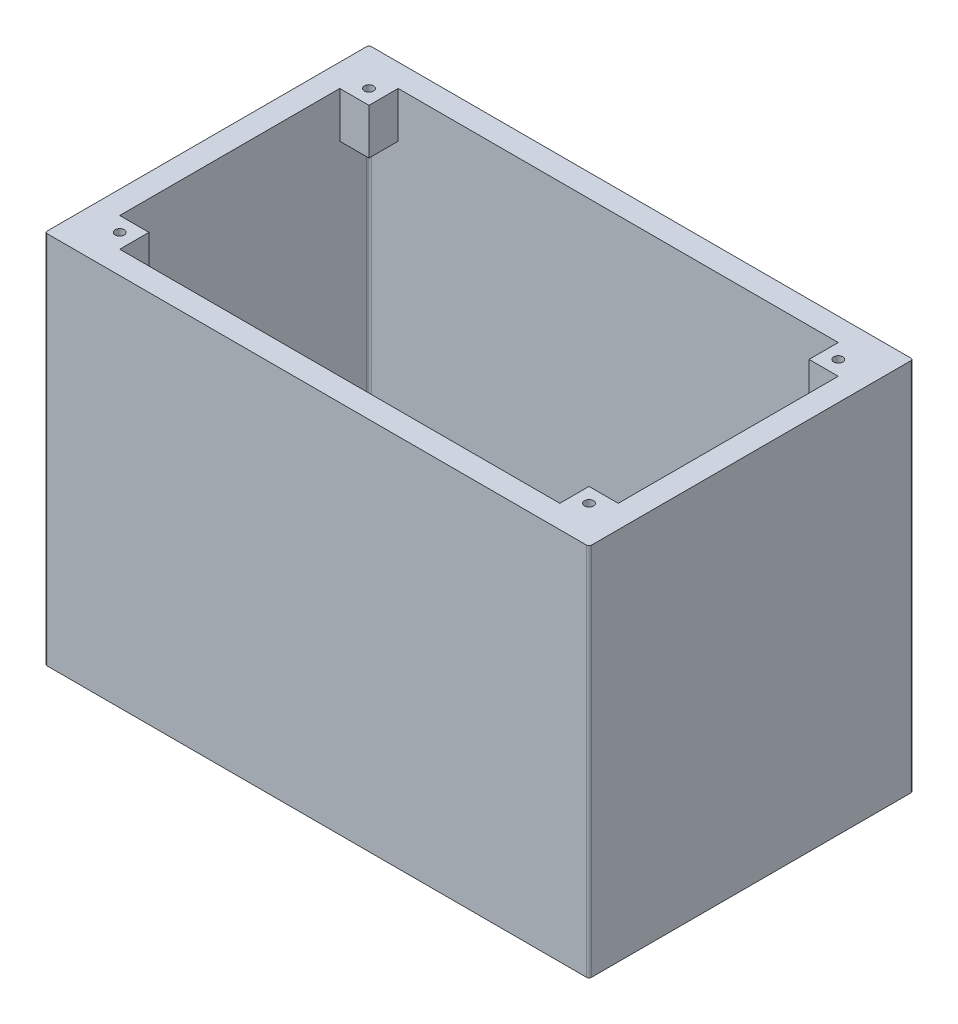
ISO-10303-21;
HEADER;
FILE_DESCRIPTION(('STEP AP214'),'2;1');
FILE_NAME('part.step','',(''),(''),'','','');
FILE_SCHEMA(('AUTOMOTIVE_DESIGN { 1 0 10303 214 1 1 1 1 }'));
ENDSEC;
DATA;
#1=APPLICATION_CONTEXT('core data for automotive mechanical design processes');
#2=APPLICATION_PROTOCOL_DEFINITION('international standard','automotive_design',2000,#1);
#3=PRODUCT_CONTEXT('',#1,'mechanical');
#4=PRODUCT('Part','Part','',(#3));
#5=PRODUCT_RELATED_PRODUCT_CATEGORY('part','',(#4));
#6=PRODUCT_DEFINITION_FORMATION('','',#4);
#7=PRODUCT_DEFINITION_CONTEXT('part definition',#1,'design');
#8=PRODUCT_DEFINITION('design','',#6,#7);
#9=PRODUCT_DEFINITION_SHAPE('','',#8);
#10=(LENGTH_UNIT() NAMED_UNIT(*) SI_UNIT(.MILLI.,.METRE.));
#11=(NAMED_UNIT(*) PLANE_ANGLE_UNIT() SI_UNIT($,.RADIAN.));
#12=(NAMED_UNIT(*) SI_UNIT($,.STERADIAN.) SOLID_ANGLE_UNIT());
#13=UNCERTAINTY_MEASURE_WITH_UNIT(LENGTH_MEASURE(1.E-05),#10,'distance_accuracy_value','');
#14=(GEOMETRIC_REPRESENTATION_CONTEXT(3) GLOBAL_UNCERTAINTY_ASSIGNED_CONTEXT((#13)) GLOBAL_UNIT_ASSIGNED_CONTEXT((#10,
#11,#12)) REPRESENTATION_CONTEXT('',''));
#15=CARTESIAN_POINT('',(0.,0.,0.));
#16=DIRECTION('',(0.,0.,1.));
#17=DIRECTION('',(1.,0.,0.));
#18=AXIS2_PLACEMENT_3D('',#15,#16,#17);
#19=CARTESIAN_POINT('',(-27.3,41.,-15.25));
#20=DIRECTION('',(1.,0.,0.));
#21=DIRECTION('',(0.,0.,-1.));
#22=AXIS2_PLACEMENT_3D('',#19,#20,#21);
#23=PLANE('',#22);
#24=CARTESIAN_POINT('',(-27.3,12.,5.49999999999999));
#25=DIRECTION('',(1.,0.,0.));
#26=DIRECTION('',(0.,0.,-1.));
#27=AXIS2_PLACEMENT_3D('',#24,#25,#26);
#28=CIRCLE('',#27,2.);
#29=CARTESIAN_POINT('',(-27.3,12.,3.49999999999999));
#30=VERTEX_POINT('',#29);
#31=EDGE_CURVE('E467',#30,#30,#28,.T.);
#32=ORIENTED_EDGE('',*,*,#31,.F.);
#33=EDGE_LOOP('',(#32));
#34=FACE_BOUND('',#33,.T.);
#35=DIRECTION('',(0.,0.,-1.));
#36=VECTOR('',#35,1.);
#37=CARTESIAN_POINT('',(-27.3,36.,0.));
#38=LINE('',#37,#36);
#39=CARTESIAN_POINT('',(-27.3,36.,15.));
#40=VERTEX_POINT('',#39);
#41=CARTESIAN_POINT('',(-27.3,36.,12.0499999999999));
#42=VERTEX_POINT('',#41);
#43=EDGE_CURVE('E232',#40,#42,#38,.T.);
#44=ORIENTED_EDGE('',*,*,#43,.F.);
#45=DIRECTION('',(0.,-1.,0.));
#46=VECTOR('',#45,1.);
#47=CARTESIAN_POINT('',(-27.3,2.5,15.));
#48=LINE('',#47,#46);
#49=CARTESIAN_POINT('',(-27.3,2.5,15.));
#50=VERTEX_POINT('',#49);
#51=EDGE_CURVE('E452',#40,#50,#48,.T.);
#52=ORIENTED_EDGE('',*,*,#51,.T.);
#53=DIRECTION('',(0.,0.,1.));
#54=VECTOR('',#53,1.);
#55=CARTESIAN_POINT('',(-27.3,2.5,-15.25));
#56=LINE('',#55,#54);
#57=CARTESIAN_POINT('',(-27.3,2.5,-15.));
#58=VERTEX_POINT('',#57);
#59=EDGE_CURVE('E350',#58,#50,#56,.T.);
#60=ORIENTED_EDGE('',*,*,#59,.F.);
#61=DIRECTION('',(0.,-1.,0.));
#62=VECTOR('',#61,1.);
#63=CARTESIAN_POINT('',(-27.3,36.,-15.));
#64=LINE('',#63,#62);
#65=CARTESIAN_POINT('',(-27.3,36.,-15.));
#66=VERTEX_POINT('',#65);
#67=EDGE_CURVE('E450',#58,#66,#64,.F.);
#68=ORIENTED_EDGE('',*,*,#67,.T.);
#69=DIRECTION('',(0.,0.,-1.));
#70=VECTOR('',#69,1.);
#71=CARTESIAN_POINT('',(-27.3,36.,0.));
#72=LINE('',#71,#70);
#73=CARTESIAN_POINT('',(-27.3,36.,-12.05));
#74=VERTEX_POINT('',#73);
#75=EDGE_CURVE('E334',#74,#66,#72,.T.);
#76=ORIENTED_EDGE('',*,*,#75,.F.);
#77=DIRECTION('',(0.,1.,0.));
#78=VECTOR('',#77,1.);
#79=CARTESIAN_POINT('',(-27.3,36.,-12.05));
#80=LINE('',#79,#78);
#81=CARTESIAN_POINT('',(-27.3,41.,-12.05));
#82=VERTEX_POINT('',#81);
#83=EDGE_CURVE('E351',#74,#82,#80,.T.);
#84=ORIENTED_EDGE('',*,*,#83,.T.);
#85=DIRECTION('',(0.,0.,1.));
#86=VECTOR('',#85,1.);
#87=CARTESIAN_POINT('',(-27.3,41.,-15.25));
#88=LINE('',#87,#86);
#89=CARTESIAN_POINT('',(-27.3,41.,12.0499999999999));
#90=VERTEX_POINT('',#89);
#91=EDGE_CURVE('E358',#82,#90,#88,.T.);
#92=ORIENTED_EDGE('',*,*,#91,.T.);
#93=DIRECTION('',(0.,1.,0.));
#94=VECTOR('',#93,1.);
#95=CARTESIAN_POINT('',(-27.3,36.,12.0499999999999));
#96=LINE('',#95,#94);
#97=EDGE_CURVE('E255',#42,#90,#96,.T.);
#98=ORIENTED_EDGE('',*,*,#97,.F.);
#99=EDGE_LOOP('',(#44,#52,#60,#68,#76,#84,#92,#98));
#100=FACE_BOUND('',#99,.T.);
#101=ADVANCED_FACE('F39',(#34,#100),#23,.T.);
#102=CARTESIAN_POINT('',(-27.3,41.,15.25));
#103=DIRECTION('',(0.,0.,-1.));
#104=DIRECTION('',(-1.,0.,0.));
#105=AXIS2_PLACEMENT_3D('',#102,#103,#104);
#106=PLANE('',#105);
#107=DIRECTION('',(-1.,0.,0.));
#108=VECTOR('',#107,1.);
#109=CARTESIAN_POINT('',(0.,36.,15.25));
#110=LINE('',#109,#108);
#111=CARTESIAN_POINT('',(27.05,36.,15.25));
#112=VERTEX_POINT('',#111);
#113=CARTESIAN_POINT('',(24.1,36.,15.25));
#114=VERTEX_POINT('',#113);
#115=EDGE_CURVE('E280',#112,#114,#110,.T.);
#116=ORIENTED_EDGE('',*,*,#115,.F.);
#117=DIRECTION('',(0.,-1.,0.));
#118=VECTOR('',#117,1.);
#119=CARTESIAN_POINT('',(27.05,2.5,15.25));
#120=LINE('',#119,#118);
#121=CARTESIAN_POINT('',(27.05,2.5,15.25));
#122=VERTEX_POINT('',#121);
#123=EDGE_CURVE('E434',#112,#122,#120,.T.);
#124=ORIENTED_EDGE('',*,*,#123,.T.);
#125=DIRECTION('',(1.,0.,0.));
#126=VECTOR('',#125,1.);
#127=CARTESIAN_POINT('',(-27.3,2.5,15.25));
#128=LINE('',#127,#126);
#129=CARTESIAN_POINT('',(-27.05,2.5,15.25));
#130=VERTEX_POINT('',#129);
#131=EDGE_CURVE('E368',#130,#122,#128,.T.);
#132=ORIENTED_EDGE('',*,*,#131,.F.);
#133=DIRECTION('',(0.,-1.,0.));
#134=VECTOR('',#133,1.);
#135=CARTESIAN_POINT('',(-27.05,36.,15.25));
#136=LINE('',#135,#134);
#137=CARTESIAN_POINT('',(-27.05,36.,15.25));
#138=VERTEX_POINT('',#137);
#139=EDGE_CURVE('E432',#130,#138,#136,.F.);
#140=ORIENTED_EDGE('',*,*,#139,.T.);
#141=DIRECTION('',(-1.,0.,0.));
#142=VECTOR('',#141,1.);
#143=CARTESIAN_POINT('',(0.,36.,15.25));
#144=LINE('',#143,#142);
#145=CARTESIAN_POINT('',(-24.1,36.,15.25));
#146=VERTEX_POINT('',#145);
#147=EDGE_CURVE('E252',#146,#138,#144,.T.);
#148=ORIENTED_EDGE('',*,*,#147,.F.);
#149=DIRECTION('',(0.,1.,0.));
#150=VECTOR('',#149,1.);
#151=CARTESIAN_POINT('',(-24.1,36.,15.25));
#152=LINE('',#151,#150);
#153=CARTESIAN_POINT('',(-24.1,41.,15.25));
#154=VERTEX_POINT('',#153);
#155=EDGE_CURVE('E247',#146,#154,#152,.T.);
#156=ORIENTED_EDGE('',*,*,#155,.T.);
#157=DIRECTION('',(1.,0.,0.));
#158=VECTOR('',#157,1.);
#159=CARTESIAN_POINT('',(-27.3,41.,15.25));
#160=LINE('',#159,#158);
#161=CARTESIAN_POINT('',(24.1,41.,15.25));
#162=VERTEX_POINT('',#161);
#163=EDGE_CURVE('E361',#154,#162,#160,.T.);
#164=ORIENTED_EDGE('',*,*,#163,.T.);
#165=DIRECTION('',(0.,1.,0.));
#166=VECTOR('',#165,1.);
#167=CARTESIAN_POINT('',(24.1,36.,15.25));
#168=LINE('',#167,#166);
#169=EDGE_CURVE('E290',#114,#162,#168,.T.);
#170=ORIENTED_EDGE('',*,*,#169,.F.);
#171=EDGE_LOOP('',(#116,#124,#132,#140,#148,#156,#164,#170));
#172=FACE_BOUND('',#171,.T.);
#173=ADVANCED_FACE('F484',(#172),#106,.T.);
#174=CARTESIAN_POINT('',(27.3,41.,-15.25));
#175=DIRECTION('',(-1.,0.,0.));
#176=DIRECTION('',(0.,0.,1.));
#177=AXIS2_PLACEMENT_3D('',#174,#175,#176);
#178=PLANE('',#177);
#179=DIRECTION('',(0.,0.,-1.));
#180=VECTOR('',#179,1.);
#181=CARTESIAN_POINT('',(27.3,2.5,-15.25));
#182=LINE('',#181,#180);
#183=CARTESIAN_POINT('',(27.3,2.5,15.));
#184=VERTEX_POINT('',#183);
#185=CARTESIAN_POINT('',(27.3,2.5,-15.));
#186=VERTEX_POINT('',#185);
#187=EDGE_CURVE('E359',#184,#186,#182,.T.);
#188=ORIENTED_EDGE('',*,*,#187,.F.);
#189=DIRECTION('',(0.,-1.,0.));
#190=VECTOR('',#189,1.);
#191=CARTESIAN_POINT('',(27.3,36.,15.));
#192=LINE('',#191,#190);
#193=CARTESIAN_POINT('',(27.3,36.,15.));
#194=VERTEX_POINT('',#193);
#195=EDGE_CURVE('E446',#184,#194,#192,.F.);
#196=ORIENTED_EDGE('',*,*,#195,.T.);
#197=DIRECTION('',(0.,0.,1.));
#198=VECTOR('',#197,1.);
#199=CARTESIAN_POINT('',(27.3,36.,0.));
#200=LINE('',#199,#198);
#201=CARTESIAN_POINT('',(27.3,36.,12.05));
#202=VERTEX_POINT('',#201);
#203=EDGE_CURVE('E271',#202,#194,#200,.T.);
#204=ORIENTED_EDGE('',*,*,#203,.F.);
#205=DIRECTION('',(0.,1.,0.));
#206=VECTOR('',#205,1.);
#207=CARTESIAN_POINT('',(27.3,36.,12.05));
#208=LINE('',#207,#206);
#209=CARTESIAN_POINT('',(27.3,41.,12.05));
#210=VERTEX_POINT('',#209);
#211=EDGE_CURVE('E282',#202,#210,#208,.T.);
#212=ORIENTED_EDGE('',*,*,#211,.T.);
#213=DIRECTION('',(0.,0.,-1.));
#214=VECTOR('',#213,1.);
#215=CARTESIAN_POINT('',(27.3,41.,-15.25));
#216=LINE('',#215,#214);
#217=CARTESIAN_POINT('',(27.3,41.,-12.05));
#218=VERTEX_POINT('',#217);
#219=EDGE_CURVE('E363',#210,#218,#216,.T.);
#220=ORIENTED_EDGE('',*,*,#219,.T.);
#221=DIRECTION('',(0.,1.,0.));
#222=VECTOR('',#221,1.);
#223=CARTESIAN_POINT('',(27.3,36.,-12.05));
#224=LINE('',#223,#222);
#225=CARTESIAN_POINT('',(27.3,36.,-12.05));
#226=VERTEX_POINT('',#225);
#227=EDGE_CURVE('E319',#226,#218,#224,.T.);
#228=ORIENTED_EDGE('',*,*,#227,.F.);
#229=DIRECTION('',(0.,0.,1.));
#230=VECTOR('',#229,1.);
#231=CARTESIAN_POINT('',(27.3,36.,0.));
#232=LINE('',#231,#230);
#233=CARTESIAN_POINT('',(27.3,36.,-15.));
#234=VERTEX_POINT('',#233);
#235=EDGE_CURVE('E306',#234,#226,#232,.T.);
#236=ORIENTED_EDGE('',*,*,#235,.F.);
#237=DIRECTION('',(0.,-1.,0.));
#238=VECTOR('',#237,1.);
#239=CARTESIAN_POINT('',(27.3,2.5,-15.));
#240=LINE('',#239,#238);
#241=EDGE_CURVE('E443',#234,#186,#240,.T.);
#242=ORIENTED_EDGE('',*,*,#241,.T.);
#243=EDGE_LOOP('',(#188,#196,#204,#212,#220,#228,#236,#242));
#244=FACE_BOUND('',#243,.T.);
#245=ADVANCED_FACE('F492',(#244),#178,.T.);
#246=CARTESIAN_POINT('',(-27.3,41.,-15.25));
#247=DIRECTION('',(0.,0.,1.));
#248=DIRECTION('',(1.,0.,0.));
#249=AXIS2_PLACEMENT_3D('',#246,#247,#248);
#250=PLANE('',#249);
#251=DIRECTION('',(-1.,0.,0.));
#252=VECTOR('',#251,1.);
#253=CARTESIAN_POINT('',(27.3,2.75,-15.25));
#254=LINE('',#253,#252);
#255=CARTESIAN_POINT('',(-27.05,2.75,-15.25));
#256=VERTEX_POINT('',#255);
#257=CARTESIAN_POINT('',(27.05,2.75,-15.25));
#258=VERTEX_POINT('',#257);
#259=EDGE_CURVE('E54',#256,#258,#254,.F.);
#260=ORIENTED_EDGE('',*,*,#259,.T.);
#261=DIRECTION('',(0.,-1.,0.));
#262=VECTOR('',#261,1.);
#263=CARTESIAN_POINT('',(27.05,36.,-15.25));
#264=LINE('',#263,#262);
#265=CARTESIAN_POINT('',(27.05,36.,-15.25));
#266=VERTEX_POINT('',#265);
#267=EDGE_CURVE('E459',#258,#266,#264,.F.);
#268=ORIENTED_EDGE('',*,*,#267,.T.);
#269=DIRECTION('',(1.,0.,0.));
#270=VECTOR('',#269,1.);
#271=CARTESIAN_POINT('',(0.,36.,-15.25));
#272=LINE('',#271,#270);
#273=CARTESIAN_POINT('',(24.1,36.,-15.25));
#274=VERTEX_POINT('',#273);
#275=EDGE_CURVE('E297',#274,#266,#272,.T.);
#276=ORIENTED_EDGE('',*,*,#275,.F.);
#277=DIRECTION('',(0.,1.,0.));
#278=VECTOR('',#277,1.);
#279=CARTESIAN_POINT('',(24.1,36.,-15.25));
#280=LINE('',#279,#278);
#281=CARTESIAN_POINT('',(24.1,41.,-15.25));
#282=VERTEX_POINT('',#281);
#283=EDGE_CURVE('E311',#274,#282,#280,.T.);
#284=ORIENTED_EDGE('',*,*,#283,.T.);
#285=DIRECTION('',(-1.,0.,0.));
#286=VECTOR('',#285,1.);
#287=CARTESIAN_POINT('',(-27.3,41.,-15.25));
#288=LINE('',#287,#286);
#289=CARTESIAN_POINT('',(-24.1,41.,-15.25));
#290=VERTEX_POINT('',#289);
#291=EDGE_CURVE('E356',#282,#290,#288,.T.);
#292=ORIENTED_EDGE('',*,*,#291,.T.);
#293=DIRECTION('',(0.,1.,0.));
#294=VECTOR('',#293,1.);
#295=CARTESIAN_POINT('',(-24.1,36.,-15.25));
#296=LINE('',#295,#294);
#297=CARTESIAN_POINT('',(-24.1,36.,-15.25));
#298=VERTEX_POINT('',#297);
#299=EDGE_CURVE('E340',#298,#290,#296,.T.);
#300=ORIENTED_EDGE('',*,*,#299,.F.);
#301=DIRECTION('',(1.,0.,0.));
#302=VECTOR('',#301,1.);
#303=CARTESIAN_POINT('',(0.,36.,-15.25));
#304=LINE('',#303,#302);
#305=CARTESIAN_POINT('',(-27.05,36.,-15.25));
#306=VERTEX_POINT('',#305);
#307=EDGE_CURVE('E332',#306,#298,#304,.T.);
#308=ORIENTED_EDGE('',*,*,#307,.F.);
#309=DIRECTION('',(0.,-1.,0.));
#310=VECTOR('',#309,1.);
#311=CARTESIAN_POINT('',(-27.05,2.5,-15.25));
#312=LINE('',#311,#310);
#313=EDGE_CURVE('E59',#306,#256,#312,.T.);
#314=ORIENTED_EDGE('',*,*,#313,.T.);
#315=EDGE_LOOP('',(#260,#268,#276,#284,#292,#300,#308,#314));
#316=FACE_BOUND('',#315,.T.);
#317=ADVANCED_FACE('F499',(#316),#250,.T.);
#318=CARTESIAN_POINT('',(-29.8,2.5,-17.75));
#319=DIRECTION('',(0.,0.,-1.));
#320=DIRECTION('',(-1.,0.,0.));
#321=AXIS2_PLACEMENT_3D('',#318,#319,#320);
#322=PLANE('',#321);
#323=DIRECTION('',(-1.,0.,0.));
#324=VECTOR('',#323,1.);
#325=CARTESIAN_POINT('',(-29.8,41.,-17.75));
#326=LINE('',#325,#324);
#327=CARTESIAN_POINT('',(29.55,41.,-17.75));
#328=VERTEX_POINT('',#327);
#329=CARTESIAN_POINT('',(-29.55,41.,-17.75));
#330=VERTEX_POINT('',#329);
#331=EDGE_CURVE('E381',#328,#330,#326,.T.);
#332=ORIENTED_EDGE('',*,*,#331,.F.);
#333=DIRECTION('',(0.,-1.,0.));
#334=VECTOR('',#333,1.);
#335=CARTESIAN_POINT('',(29.55,0.,-17.75));
#336=LINE('',#335,#334);
#337=CARTESIAN_POINT('',(29.55,0.,-17.75));
#338=VERTEX_POINT('',#337);
#339=EDGE_CURVE('E398',#328,#338,#336,.T.);
#340=ORIENTED_EDGE('',*,*,#339,.T.);
#341=DIRECTION('',(1.,0.,0.));
#342=VECTOR('',#341,1.);
#343=CARTESIAN_POINT('',(-29.8,0.,-17.75));
#344=LINE('',#343,#342);
#345=CARTESIAN_POINT('',(-29.55,0.,-17.75));
#346=VERTEX_POINT('',#345);
#347=EDGE_CURVE('E384',#346,#338,#344,.T.);
#348=ORIENTED_EDGE('',*,*,#347,.F.);
#349=DIRECTION('',(0.,-1.,0.));
#350=VECTOR('',#349,1.);
#351=CARTESIAN_POINT('',(-29.55,2.5,-17.75));
#352=LINE('',#351,#350);
#353=EDGE_CURVE('E396',#346,#330,#352,.F.);
#354=ORIENTED_EDGE('',*,*,#353,.T.);
#355=EDGE_LOOP('',(#332,#340,#348,#354));
#356=FACE_BOUND('',#355,.T.);
#357=ADVANCED_FACE('F502',(#356),#322,.T.);
#358=CARTESIAN_POINT('',(-29.8,2.5,17.75));
#359=DIRECTION('',(-1.,0.,0.));
#360=DIRECTION('',(0.,0.,1.));
#361=AXIS2_PLACEMENT_3D('',#358,#359,#360);
#362=PLANE('',#361);
#363=CARTESIAN_POINT('',(-29.8,12.,5.49999999999999));
#364=DIRECTION('',(-1.,0.,0.));
#365=DIRECTION('',(0.,0.,1.));
#366=AXIS2_PLACEMENT_3D('',#363,#364,#365);
#367=CIRCLE('',#366,2.3);
#368=CARTESIAN_POINT('',(-29.8,12.,7.79999999999999));
#369=VERTEX_POINT('',#368);
#370=EDGE_CURVE('E11',#369,#369,#367,.F.);
#371=ORIENTED_EDGE('',*,*,#370,.T.);
#372=EDGE_LOOP('',(#371));
#373=FACE_BOUND('',#372,.T.);
#374=DIRECTION('',(0.,0.,1.));
#375=VECTOR('',#374,1.);
#376=CARTESIAN_POINT('',(-29.8,41.,-17.75));
#377=LINE('',#376,#375);
#378=CARTESIAN_POINT('',(-29.8,41.,-17.5));
#379=VERTEX_POINT('',#378);
#380=CARTESIAN_POINT('',(-29.8,41.,17.5));
#381=VERTEX_POINT('',#380);
#382=EDGE_CURVE('E365',#379,#381,#377,.T.);
#383=ORIENTED_EDGE('',*,*,#382,.F.);
#384=DIRECTION('',(0.,-1.,0.));
#385=VECTOR('',#384,1.);
#386=CARTESIAN_POINT('',(-29.8,2.5,-17.5));
#387=LINE('',#386,#385);
#388=CARTESIAN_POINT('',(-29.8,0.,-17.5));
#389=VERTEX_POINT('',#388);
#390=EDGE_CURVE('E429',#379,#389,#387,.T.);
#391=ORIENTED_EDGE('',*,*,#390,.T.);
#392=DIRECTION('',(0.,0.,-1.));
#393=VECTOR('',#392,1.);
#394=CARTESIAN_POINT('',(-29.8,0.,17.75));
#395=LINE('',#394,#393);
#396=CARTESIAN_POINT('',(-29.8,0.,17.5));
#397=VERTEX_POINT('',#396);
#398=EDGE_CURVE('E393',#397,#389,#395,.T.);
#399=ORIENTED_EDGE('',*,*,#398,.F.);
#400=DIRECTION('',(0.,-1.,0.));
#401=VECTOR('',#400,1.);
#402=CARTESIAN_POINT('',(-29.8,41.,17.5));
#403=LINE('',#402,#401);
#404=EDGE_CURVE('E427',#397,#381,#403,.F.);
#405=ORIENTED_EDGE('',*,*,#404,.T.);
#406=EDGE_LOOP('',(#383,#391,#399,#405));
#407=FACE_BOUND('',#406,.T.);
#408=ADVANCED_FACE('F517',(#373,#407),#362,.T.);
#409=CARTESIAN_POINT('',(-29.8,2.5,17.75));
#410=DIRECTION('',(0.,0.,-1.));
#411=DIRECTION('',(-1.,0.,0.));
#412=AXIS2_PLACEMENT_3D('',#409,#410,#411);
#413=PLANE('',#412);
#414=DIRECTION('',(1.,0.,0.));
#415=VECTOR('',#414,1.);
#416=CARTESIAN_POINT('',(-29.8,0.,17.75));
#417=LINE('',#416,#415);
#418=CARTESIAN_POINT('',(-29.55,0.,17.75));
#419=VERTEX_POINT('',#418);
#420=CARTESIAN_POINT('',(29.55,0.,17.75));
#421=VERTEX_POINT('',#420);
#422=EDGE_CURVE('E390',#419,#421,#417,.T.);
#423=ORIENTED_EDGE('',*,*,#422,.T.);
#424=DIRECTION('',(0.,-1.,0.));
#425=VECTOR('',#424,1.);
#426=CARTESIAN_POINT('',(29.55,2.5,17.75));
#427=LINE('',#426,#425);
#428=CARTESIAN_POINT('',(29.55,41.,17.75));
#429=VERTEX_POINT('',#428);
#430=EDGE_CURVE('E425',#421,#429,#427,.F.);
#431=ORIENTED_EDGE('',*,*,#430,.T.);
#432=DIRECTION('',(1.,0.,0.));
#433=VECTOR('',#432,1.);
#434=CARTESIAN_POINT('',(-29.8,41.,17.75));
#435=LINE('',#434,#433);
#436=CARTESIAN_POINT('',(-29.55,41.,17.75));
#437=VERTEX_POINT('',#436);
#438=EDGE_CURVE('E375',#437,#429,#435,.T.);
#439=ORIENTED_EDGE('',*,*,#438,.F.);
#440=DIRECTION('',(0.,-1.,0.));
#441=VECTOR('',#440,1.);
#442=CARTESIAN_POINT('',(-29.55,0.,17.75));
#443=LINE('',#442,#441);
#444=EDGE_CURVE('E422',#437,#419,#443,.T.);
#445=ORIENTED_EDGE('',*,*,#444,.T.);
#446=EDGE_LOOP('',(#423,#431,#439,#445));
#447=FACE_BOUND('',#446,.T.);
#448=ADVANCED_FACE('F519',(#447),#413,.F.);
#449=CARTESIAN_POINT('',(29.8,2.5,17.75));
#450=DIRECTION('',(-1.,0.,0.));
#451=DIRECTION('',(0.,0.,1.));
#452=AXIS2_PLACEMENT_3D('',#449,#450,#451);
#453=PLANE('',#452);
#454=DIRECTION('',(0.,0.,-1.));
#455=VECTOR('',#454,1.);
#456=CARTESIAN_POINT('',(29.8,0.,17.75));
#457=LINE('',#456,#455);
#458=CARTESIAN_POINT('',(29.8,0.,17.5));
#459=VERTEX_POINT('',#458);
#460=CARTESIAN_POINT('',(29.8,0.,-17.5));
#461=VERTEX_POINT('',#460);
#462=EDGE_CURVE('E387',#459,#461,#457,.T.);
#463=ORIENTED_EDGE('',*,*,#462,.T.);
#464=DIRECTION('',(0.,-1.,0.));
#465=VECTOR('',#464,1.);
#466=CARTESIAN_POINT('',(29.8,41.,-17.5));
#467=LINE('',#466,#465);
#468=CARTESIAN_POINT('',(29.8,41.,-17.5));
#469=VERTEX_POINT('',#468);
#470=EDGE_CURVE('E412',#461,#469,#467,.F.);
#471=ORIENTED_EDGE('',*,*,#470,.T.);
#472=DIRECTION('',(0.,0.,-1.));
#473=VECTOR('',#472,1.);
#474=CARTESIAN_POINT('',(29.8,41.,-17.75));
#475=LINE('',#474,#473);
#476=CARTESIAN_POINT('',(29.8,41.,17.5));
#477=VERTEX_POINT('',#476);
#478=EDGE_CURVE('E378',#477,#469,#475,.T.);
#479=ORIENTED_EDGE('',*,*,#478,.F.);
#480=DIRECTION('',(0.,-1.,0.));
#481=VECTOR('',#480,1.);
#482=CARTESIAN_POINT('',(29.8,2.5,17.5));
#483=LINE('',#482,#481);
#484=EDGE_CURVE('E409',#477,#459,#483,.T.);
#485=ORIENTED_EDGE('',*,*,#484,.T.);
#486=EDGE_LOOP('',(#463,#471,#479,#485));
#487=FACE_BOUND('',#486,.T.);
#488=ADVANCED_FACE('F515',(#487),#453,.F.);
#489=CARTESIAN_POINT('',(0.,0.,0.));
#490=DIRECTION('',(0.,1.,0.));
#491=DIRECTION('',(0.,0.,1.));
#492=AXIS2_PLACEMENT_3D('',#489,#490,#491);
#493=PLANE('',#492);
#494=ORIENTED_EDGE('',*,*,#347,.T.);
#495=CARTESIAN_POINT('',(29.55,0.,-17.5));
#496=DIRECTION('',(0.,1.,0.));
#497=DIRECTION('',(0.,0.,1.));
#498=AXIS2_PLACEMENT_3D('',#495,#496,#497);
#499=CIRCLE('',#498,0.25);
#500=EDGE_CURVE('E407',#338,#461,#499,.F.);
#501=ORIENTED_EDGE('',*,*,#500,.T.);
#502=ORIENTED_EDGE('',*,*,#462,.F.);
#503=CARTESIAN_POINT('',(29.55,0.,17.5));
#504=DIRECTION('',(0.,1.,0.));
#505=DIRECTION('',(0.,0.,1.));
#506=AXIS2_PLACEMENT_3D('',#503,#504,#505);
#507=CIRCLE('',#506,0.25);
#508=EDGE_CURVE('E405',#459,#421,#507,.F.);
#509=ORIENTED_EDGE('',*,*,#508,.T.);
#510=ORIENTED_EDGE('',*,*,#422,.F.);
#511=CARTESIAN_POINT('',(-29.55,0.,17.5));
#512=DIRECTION('',(0.,1.,0.));
#513=DIRECTION('',(0.,0.,1.));
#514=AXIS2_PLACEMENT_3D('',#511,#512,#513);
#515=CIRCLE('',#514,0.25);
#516=EDGE_CURVE('E401',#419,#397,#515,.F.);
#517=ORIENTED_EDGE('',*,*,#516,.T.);
#518=ORIENTED_EDGE('',*,*,#398,.T.);
#519=CARTESIAN_POINT('',(-29.55,0.,-17.5));
#520=DIRECTION('',(0.,1.,0.));
#521=DIRECTION('',(0.,0.,1.));
#522=AXIS2_PLACEMENT_3D('',#519,#520,#521);
#523=CIRCLE('',#522,0.25);
#524=EDGE_CURVE('E403',#389,#346,#523,.F.);
#525=ORIENTED_EDGE('',*,*,#524,.T.);
#526=EDGE_LOOP('',(#494,#501,#502,#509,#510,#517,#518,#525));
#527=FACE_BOUND('',#526,.T.);
#528=ADVANCED_FACE('F507',(#527),#493,.F.);
#529=CARTESIAN_POINT('',(0.,41.,0.));
#530=DIRECTION('',(0.,1.,0.));
#531=DIRECTION('',(0.,0.,1.));
#532=AXIS2_PLACEMENT_3D('',#529,#530,#531);
#533=PLANE('',#532);
#534=ORIENTED_EDGE('',*,*,#163,.F.);
#535=DIRECTION('',(0.,0.,-1.));
#536=VECTOR('',#535,1.);
#537=CARTESIAN_POINT('',(-24.1,41.,-1.04517089427603E-13));
#538=LINE('',#537,#536);
#539=CARTESIAN_POINT('',(-24.1,41.,12.0499999999999));
#540=VERTEX_POINT('',#539);
#541=EDGE_CURVE('E261',#154,#540,#538,.T.);
#542=ORIENTED_EDGE('',*,*,#541,.T.);
#543=DIRECTION('',(1.,0.,0.));
#544=VECTOR('',#543,1.);
#545=CARTESIAN_POINT('',(0.,41.,12.05));
#546=LINE('',#545,#544);
#547=EDGE_CURVE('E242',#90,#540,#546,.T.);
#548=ORIENTED_EDGE('',*,*,#547,.F.);
#549=ORIENTED_EDGE('',*,*,#91,.F.);
#550=DIRECTION('',(1.,0.,0.));
#551=VECTOR('',#550,1.);
#552=CARTESIAN_POINT('',(0.,41.,-12.05));
#553=LINE('',#552,#551);
#554=CARTESIAN_POINT('',(-24.1,41.,-12.05));
#555=VERTEX_POINT('',#554);
#556=EDGE_CURVE('E330',#82,#555,#553,.T.);
#557=ORIENTED_EDGE('',*,*,#556,.T.);
#558=DIRECTION('',(0.,0.,1.));
#559=VECTOR('',#558,1.);
#560=CARTESIAN_POINT('',(-24.1,41.,0.));
#561=LINE('',#560,#559);
#562=EDGE_CURVE('E343',#290,#555,#561,.T.);
#563=ORIENTED_EDGE('',*,*,#562,.F.);
#564=ORIENTED_EDGE('',*,*,#291,.F.);
#565=DIRECTION('',(0.,0.,1.));
#566=VECTOR('',#565,1.);
#567=CARTESIAN_POINT('',(24.1,41.,0.));
#568=LINE('',#567,#566);
#569=CARTESIAN_POINT('',(24.1,41.,-12.05));
#570=VERTEX_POINT('',#569);
#571=EDGE_CURVE('E293',#282,#570,#568,.T.);
#572=ORIENTED_EDGE('',*,*,#571,.T.);
#573=DIRECTION('',(-1.,0.,0.));
#574=VECTOR('',#573,1.);
#575=CARTESIAN_POINT('',(0.,41.,-12.05));
#576=LINE('',#575,#574);
#577=EDGE_CURVE('E314',#218,#570,#576,.T.);
#578=ORIENTED_EDGE('',*,*,#577,.F.);
#579=ORIENTED_EDGE('',*,*,#219,.F.);
#580=DIRECTION('',(-1.,0.,0.));
#581=VECTOR('',#580,1.);
#582=CARTESIAN_POINT('',(0.,41.,12.05));
#583=LINE('',#582,#581);
#584=CARTESIAN_POINT('',(24.1,41.,12.05));
#585=VERTEX_POINT('',#584);
#586=EDGE_CURVE('E285',#210,#585,#583,.T.);
#587=ORIENTED_EDGE('',*,*,#586,.T.);
#588=DIRECTION('',(0.,0.,-1.));
#589=VECTOR('',#588,1.);
#590=CARTESIAN_POINT('',(24.1,41.,0.));
#591=LINE('',#590,#589);
#592=EDGE_CURVE('E272',#162,#585,#591,.T.);
#593=ORIENTED_EDGE('',*,*,#592,.F.);
#594=EDGE_LOOP('',(#534,#542,#548,#549,#557,#563,#564,#572,#578,#579,#587,#593));
#595=FACE_BOUND('',#594,.T.);
#596=ORIENTED_EDGE('',*,*,#478,.T.);
#597=CARTESIAN_POINT('',(29.55,41.,-17.5));
#598=DIRECTION('',(0.,1.,0.));
#599=DIRECTION('',(0.,0.,1.));
#600=AXIS2_PLACEMENT_3D('',#597,#598,#599);
#601=CIRCLE('',#600,0.25);
#602=EDGE_CURVE('E420',#469,#328,#601,.T.);
#603=ORIENTED_EDGE('',*,*,#602,.T.);
#604=ORIENTED_EDGE('',*,*,#331,.T.);
#605=CARTESIAN_POINT('',(-29.55,41.,-17.5));
#606=DIRECTION('',(0.,1.,0.));
#607=DIRECTION('',(0.,0.,1.));
#608=AXIS2_PLACEMENT_3D('',#605,#606,#607);
#609=CIRCLE('',#608,0.25);
#610=EDGE_CURVE('E416',#330,#379,#609,.T.);
#611=ORIENTED_EDGE('',*,*,#610,.T.);
#612=ORIENTED_EDGE('',*,*,#382,.T.);
#613=CARTESIAN_POINT('',(-29.55,41.,17.5));
#614=DIRECTION('',(0.,1.,0.));
#615=DIRECTION('',(0.,0.,1.));
#616=AXIS2_PLACEMENT_3D('',#613,#614,#615);
#617=CIRCLE('',#616,0.25);
#618=EDGE_CURVE('E414',#381,#437,#617,.T.);
#619=ORIENTED_EDGE('',*,*,#618,.T.);
#620=ORIENTED_EDGE('',*,*,#438,.T.);
#621=CARTESIAN_POINT('',(29.55,41.,17.5));
#622=DIRECTION('',(0.,1.,0.));
#623=DIRECTION('',(0.,0.,1.));
#624=AXIS2_PLACEMENT_3D('',#621,#622,#623);
#625=CIRCLE('',#624,0.25);
#626=EDGE_CURVE('E418',#429,#477,#625,.T.);
#627=ORIENTED_EDGE('',*,*,#626,.T.);
#628=EDGE_LOOP('',(#596,#603,#604,#611,#612,#619,#620,#627));
#629=FACE_BOUND('',#628,.T.);
#630=CARTESIAN_POINT('',(-25.7,41.,-13.65));
#631=DIRECTION('',(0.,1.,0.));
#632=DIRECTION('',(0.,0.,1.));
#633=AXIS2_PLACEMENT_3D('',#630,#631,#632);
#634=CIRCLE('',#633,0.499999999999999);
#635=CARTESIAN_POINT('',(-25.7,41.,-13.15));
#636=VERTEX_POINT('',#635);
#637=EDGE_CURVE('E322',#636,#636,#634,.T.);
#638=ORIENTED_EDGE('',*,*,#637,.F.);
#639=EDGE_LOOP('',(#638));
#640=FACE_BOUND('',#639,.T.);
#641=CARTESIAN_POINT('',(25.7,41.,-13.65));
#642=DIRECTION('',(0.,1.,0.));
#643=DIRECTION('',(0.,0.,1.));
#644=AXIS2_PLACEMENT_3D('',#641,#642,#643);
#645=CIRCLE('',#644,0.499999999999999);
#646=CARTESIAN_POINT('',(25.7,41.,-13.15));
#647=VERTEX_POINT('',#646);
#648=EDGE_CURVE('E301',#647,#647,#645,.F.);
#649=ORIENTED_EDGE('',*,*,#648,.T.);
#650=EDGE_LOOP('',(#649));
#651=FACE_BOUND('',#650,.T.);
#652=CARTESIAN_POINT('',(25.7,41.,13.65));
#653=DIRECTION('',(0.,1.,0.));
#654=DIRECTION('',(0.,0.,1.));
#655=AXIS2_PLACEMENT_3D('',#652,#653,#654);
#656=CIRCLE('',#655,0.499999999999999);
#657=CARTESIAN_POINT('',(25.7,41.,14.15));
#658=VERTEX_POINT('',#657);
#659=EDGE_CURVE('E246',#658,#658,#656,.T.);
#660=ORIENTED_EDGE('',*,*,#659,.F.);
#661=EDGE_LOOP('',(#660));
#662=FACE_BOUND('',#661,.T.);
#663=CARTESIAN_POINT('',(-25.7,41.,13.6499999999999));
#664=DIRECTION('',(0.,1.,0.));
#665=DIRECTION('',(0.,0.,1.));
#666=AXIS2_PLACEMENT_3D('',#663,#664,#665);
#667=CIRCLE('',#666,0.499999999999999);
#668=CARTESIAN_POINT('',(-25.7,41.,14.1499999999999));
#669=VERTEX_POINT('',#668);
#670=EDGE_CURVE('E236',#669,#669,#667,.F.);
#671=ORIENTED_EDGE('',*,*,#670,.T.);
#672=EDGE_LOOP('',(#671));
#673=FACE_BOUND('',#672,.T.);
#674=ADVANCED_FACE('F503',(#595,#629,#640,#651,#662,#673),#533,.T.);
#675=CARTESIAN_POINT('',(0.,2.5,0.));
#676=DIRECTION('',(0.,1.,0.));
#677=DIRECTION('',(0.,0.,1.));
#678=AXIS2_PLACEMENT_3D('',#675,#676,#677);
#679=PLANE('',#678);
#680=ORIENTED_EDGE('',*,*,#131,.T.);
#681=CARTESIAN_POINT('',(27.05,2.5,15.));
#682=DIRECTION('',(0.,1.,0.));
#683=DIRECTION('',(0.,0.,1.));
#684=AXIS2_PLACEMENT_3D('',#681,#682,#683);
#685=CIRCLE('',#684,0.25);
#686=EDGE_CURVE('E441',#122,#184,#685,.T.);
#687=ORIENTED_EDGE('',*,*,#686,.T.);
#688=ORIENTED_EDGE('',*,*,#187,.T.);
#689=DIRECTION('',(-1.,0.,0.));
#690=VECTOR('',#689,1.);
#691=CARTESIAN_POINT('',(-27.3,2.5,-15.));
#692=LINE('',#691,#690);
#693=EDGE_CURVE('E437',#186,#58,#692,.T.);
#694=ORIENTED_EDGE('',*,*,#693,.T.);
#695=ORIENTED_EDGE('',*,*,#59,.T.);
#696=CARTESIAN_POINT('',(-27.05,2.5,15.));
#697=DIRECTION('',(0.,1.,0.));
#698=DIRECTION('',(0.,0.,1.));
#699=AXIS2_PLACEMENT_3D('',#696,#697,#698);
#700=CIRCLE('',#699,0.25);
#701=EDGE_CURVE('E439',#50,#130,#700,.T.);
#702=ORIENTED_EDGE('',*,*,#701,.T.);
#703=EDGE_LOOP('',(#680,#687,#688,#694,#695,#702));
#704=FACE_BOUND('',#703,.T.);
#705=ADVANCED_FACE('F506',(#704),#679,.T.);
#706=CARTESIAN_POINT('',(-24.1,36.,0.));
#707=DIRECTION('',(-1.,0.,0.));
#708=DIRECTION('',(0.,0.,1.));
#709=AXIS2_PLACEMENT_3D('',#706,#707,#708);
#710=PLANE('',#709);
#711=ORIENTED_EDGE('',*,*,#562,.T.);
#712=DIRECTION('',(0.,1.,0.));
#713=VECTOR('',#712,1.);
#714=CARTESIAN_POINT('',(-24.1,36.,-12.05));
#715=LINE('',#714,#713);
#716=CARTESIAN_POINT('',(-24.1,36.,-12.05));
#717=VERTEX_POINT('',#716);
#718=EDGE_CURVE('E348',#717,#555,#715,.T.);
#719=ORIENTED_EDGE('',*,*,#718,.F.);
#720=DIRECTION('',(0.,0.,1.));
#721=VECTOR('',#720,1.);
#722=CARTESIAN_POINT('',(-24.1,36.,0.));
#723=LINE('',#722,#721);
#724=EDGE_CURVE('E329',#298,#717,#723,.T.);
#725=ORIENTED_EDGE('',*,*,#724,.F.);
#726=ORIENTED_EDGE('',*,*,#299,.T.);
#727=EDGE_LOOP('',(#711,#719,#725,#726));
#728=FACE_BOUND('',#727,.T.);
#729=ADVANCED_FACE('F511',(#728),#710,.F.);
#730=CARTESIAN_POINT('',(0.,36.,-12.05));
#731=DIRECTION('',(0.,0.,1.));
#732=DIRECTION('',(1.,0.,0.));
#733=AXIS2_PLACEMENT_3D('',#730,#731,#732);
#734=PLANE('',#733);
#735=ORIENTED_EDGE('',*,*,#556,.F.);
#736=ORIENTED_EDGE('',*,*,#83,.F.);
#737=DIRECTION('',(1.,0.,0.));
#738=VECTOR('',#737,1.);
#739=CARTESIAN_POINT('',(0.,36.,-12.05));
#740=LINE('',#739,#738);
#741=EDGE_CURVE('E337',#74,#717,#740,.T.);
#742=ORIENTED_EDGE('',*,*,#741,.T.);
#743=ORIENTED_EDGE('',*,*,#718,.T.);
#744=EDGE_LOOP('',(#735,#736,#742,#743));
#745=FACE_BOUND('',#744,.T.);
#746=ADVANCED_FACE('F579',(#745),#734,.T.);
#747=CARTESIAN_POINT('',(-25.7,36.,-13.65));
#748=DIRECTION('',(0.,1.,0.));
#749=DIRECTION('',(0.,0.,1.));
#750=AXIS2_PLACEMENT_3D('',#747,#748,#749);
#751=CYLINDRICAL_SURFACE('',#750,0.499999999999999);
#752=CARTESIAN_POINT('',(-25.7,36.,-13.65));
#753=DIRECTION('',(0.,1.,0.));
#754=DIRECTION('',(0.,0.,1.));
#755=AXIS2_PLACEMENT_3D('',#752,#753,#754);
#756=CIRCLE('',#755,0.499999999999999);
#757=CARTESIAN_POINT('',(-25.7,36.,-13.15));
#758=VERTEX_POINT('',#757);
#759=EDGE_CURVE('E326',#758,#758,#756,.T.);
#760=ORIENTED_EDGE('',*,*,#759,.F.);
#761=EDGE_LOOP('',(#760));
#762=FACE_BOUND('',#761,.T.);
#763=ORIENTED_EDGE('',*,*,#637,.T.);
#764=EDGE_LOOP('',(#763));
#765=FACE_BOUND('',#764,.T.);
#766=ADVANCED_FACE('F637',(#762,#765),#751,.F.);
#767=CARTESIAN_POINT('',(0.,36.,0.));
#768=DIRECTION('',(0.,1.,0.));
#769=DIRECTION('',(0.,0.,1.));
#770=AXIS2_PLACEMENT_3D('',#767,#768,#769);
#771=PLANE('',#770);
#772=ORIENTED_EDGE('',*,*,#759,.T.);
#773=EDGE_LOOP('',(#772));
#774=FACE_BOUND('',#773,.T.);
#775=ORIENTED_EDGE('',*,*,#75,.T.);
#776=CARTESIAN_POINT('',(-27.05,36.,-15.));
#777=DIRECTION('',(0.,1.,0.));
#778=DIRECTION('',(0.,0.,1.));
#779=AXIS2_PLACEMENT_3D('',#776,#777,#778);
#780=CIRCLE('',#779,0.25);
#781=EDGE_CURVE('E463',#66,#306,#780,.F.);
#782=ORIENTED_EDGE('',*,*,#781,.T.);
#783=ORIENTED_EDGE('',*,*,#307,.T.);
#784=ORIENTED_EDGE('',*,*,#724,.T.);
#785=ORIENTED_EDGE('',*,*,#741,.F.);
#786=EDGE_LOOP('',(#775,#782,#783,#784,#785));
#787=FACE_BOUND('',#786,.T.);
#788=ADVANCED_FACE('F568',(#774,#787),#771,.F.);
#789=CARTESIAN_POINT('',(0.,36.,-12.05));
#790=DIRECTION('',(0.,0.,-1.));
#791=DIRECTION('',(-1.,0.,0.));
#792=AXIS2_PLACEMENT_3D('',#789,#790,#791);
#793=PLANE('',#792);
#794=ORIENTED_EDGE('',*,*,#577,.T.);
#795=DIRECTION('',(0.,1.,0.));
#796=VECTOR('',#795,1.);
#797=CARTESIAN_POINT('',(24.1,36.,-12.05));
#798=LINE('',#797,#796);
#799=CARTESIAN_POINT('',(24.1,36.,-12.05));
#800=VERTEX_POINT('',#799);
#801=EDGE_CURVE('E323',#800,#570,#798,.T.);
#802=ORIENTED_EDGE('',*,*,#801,.F.);
#803=DIRECTION('',(-1.,0.,0.));
#804=VECTOR('',#803,1.);
#805=CARTESIAN_POINT('',(0.,36.,-12.05));
#806=LINE('',#805,#804);
#807=EDGE_CURVE('E304',#226,#800,#806,.T.);
#808=ORIENTED_EDGE('',*,*,#807,.F.);
#809=ORIENTED_EDGE('',*,*,#227,.T.);
#810=EDGE_LOOP('',(#794,#802,#808,#809));
#811=FACE_BOUND('',#810,.T.);
#812=ADVANCED_FACE('F627',(#811),#793,.F.);
#813=CARTESIAN_POINT('',(24.1,36.,0.));
#814=DIRECTION('',(-1.,0.,0.));
#815=DIRECTION('',(0.,0.,1.));
#816=AXIS2_PLACEMENT_3D('',#813,#814,#815);
#817=PLANE('',#816);
#818=ORIENTED_EDGE('',*,*,#571,.F.);
#819=ORIENTED_EDGE('',*,*,#283,.F.);
#820=DIRECTION('',(0.,0.,1.));
#821=VECTOR('',#820,1.);
#822=CARTESIAN_POINT('',(24.1,36.,0.));
#823=LINE('',#822,#821);
#824=EDGE_CURVE('E300',#274,#800,#823,.T.);
#825=ORIENTED_EDGE('',*,*,#824,.T.);
#826=ORIENTED_EDGE('',*,*,#801,.T.);
#827=EDGE_LOOP('',(#818,#819,#825,#826));
#828=FACE_BOUND('',#827,.T.);
#829=ADVANCED_FACE('F601',(#828),#817,.T.);
#830=CARTESIAN_POINT('',(25.7,36.,-13.65));
#831=DIRECTION('',(0.,1.,0.));
#832=DIRECTION('',(0.,0.,1.));
#833=AXIS2_PLACEMENT_3D('',#830,#831,#832);
#834=CYLINDRICAL_SURFACE('',#833,0.499999999999999);
#835=CARTESIAN_POINT('',(25.7,36.,-13.65));
#836=DIRECTION('',(0.,1.,0.));
#837=DIRECTION('',(0.,0.,1.));
#838=AXIS2_PLACEMENT_3D('',#835,#836,#837);
#839=CIRCLE('',#838,0.499999999999999);
#840=CARTESIAN_POINT('',(25.7,36.,-13.15));
#841=VERTEX_POINT('',#840);
#842=EDGE_CURVE('E308',#841,#841,#839,.F.);
#843=ORIENTED_EDGE('',*,*,#842,.T.);
#844=EDGE_LOOP('',(#843));
#845=FACE_BOUND('',#844,.T.);
#846=ORIENTED_EDGE('',*,*,#648,.F.);
#847=EDGE_LOOP('',(#846));
#848=FACE_BOUND('',#847,.T.);
#849=ADVANCED_FACE('F634',(#845,#848),#834,.F.);
#850=CARTESIAN_POINT('',(0.,36.,0.));
#851=DIRECTION('',(0.,1.,0.));
#852=DIRECTION('',(0.,0.,1.));
#853=AXIS2_PLACEMENT_3D('',#850,#851,#852);
#854=PLANE('',#853);
#855=ORIENTED_EDGE('',*,*,#275,.T.);
#856=CARTESIAN_POINT('',(27.05,36.,-15.));
#857=DIRECTION('',(0.,1.,0.));
#858=DIRECTION('',(0.,0.,1.));
#859=AXIS2_PLACEMENT_3D('',#856,#857,#858);
#860=CIRCLE('',#859,0.25);
#861=EDGE_CURVE('E461',#266,#234,#860,.F.);
#862=ORIENTED_EDGE('',*,*,#861,.T.);
#863=ORIENTED_EDGE('',*,*,#235,.T.);
#864=ORIENTED_EDGE('',*,*,#807,.T.);
#865=ORIENTED_EDGE('',*,*,#824,.F.);
#866=EDGE_LOOP('',(#855,#862,#863,#864,#865));
#867=FACE_BOUND('',#866,.T.);
#868=ORIENTED_EDGE('',*,*,#842,.F.);
#869=EDGE_LOOP('',(#868));
#870=FACE_BOUND('',#869,.T.);
#871=ADVANCED_FACE('F595',(#867,#870),#854,.F.);
#872=CARTESIAN_POINT('',(24.1,36.,0.));
#873=DIRECTION('',(1.,0.,0.));
#874=DIRECTION('',(0.,0.,-1.));
#875=AXIS2_PLACEMENT_3D('',#872,#873,#874);
#876=PLANE('',#875);
#877=ORIENTED_EDGE('',*,*,#592,.T.);
#878=DIRECTION('',(0.,1.,0.));
#879=VECTOR('',#878,1.);
#880=CARTESIAN_POINT('',(24.1,36.,12.05));
#881=LINE('',#880,#879);
#882=CARTESIAN_POINT('',(24.1,36.,12.05));
#883=VERTEX_POINT('',#882);
#884=EDGE_CURVE('E294',#883,#585,#881,.T.);
#885=ORIENTED_EDGE('',*,*,#884,.F.);
#886=DIRECTION('',(0.,0.,-1.));
#887=VECTOR('',#886,1.);
#888=CARTESIAN_POINT('',(24.1,36.,0.));
#889=LINE('',#888,#887);
#890=EDGE_CURVE('E278',#114,#883,#889,.T.);
#891=ORIENTED_EDGE('',*,*,#890,.F.);
#892=ORIENTED_EDGE('',*,*,#169,.T.);
#893=EDGE_LOOP('',(#877,#885,#891,#892));
#894=FACE_BOUND('',#893,.T.);
#895=ADVANCED_FACE('F610',(#894),#876,.F.);
#896=CARTESIAN_POINT('',(25.7,36.,13.65));
#897=DIRECTION('',(0.,1.,0.));
#898=DIRECTION('',(0.,0.,1.));
#899=AXIS2_PLACEMENT_3D('',#896,#897,#898);
#900=CYLINDRICAL_SURFACE('',#899,0.499999999999999);
#901=CARTESIAN_POINT('',(25.7,36.,13.65));
#902=DIRECTION('',(0.,1.,0.));
#903=DIRECTION('',(0.,0.,1.));
#904=AXIS2_PLACEMENT_3D('',#901,#902,#903);
#905=CIRCLE('',#904,0.499999999999999);
#906=CARTESIAN_POINT('',(25.7,36.,14.15));
#907=VERTEX_POINT('',#906);
#908=EDGE_CURVE('E268',#907,#907,#905,.T.);
#909=ORIENTED_EDGE('',*,*,#908,.F.);
#910=EDGE_LOOP('',(#909));
#911=FACE_BOUND('',#910,.T.);
#912=ORIENTED_EDGE('',*,*,#659,.T.);
#913=EDGE_LOOP('',(#912));
#914=FACE_BOUND('',#913,.T.);
#915=ADVANCED_FACE('F805',(#911,#914),#900,.F.);
#916=CARTESIAN_POINT('',(0.,36.,12.05));
#917=DIRECTION('',(0.,0.,-1.));
#918=DIRECTION('',(-1.,0.,0.));
#919=AXIS2_PLACEMENT_3D('',#916,#917,#918);
#920=PLANE('',#919);
#921=ORIENTED_EDGE('',*,*,#586,.F.);
#922=ORIENTED_EDGE('',*,*,#211,.F.);
#923=DIRECTION('',(-1.,0.,0.));
#924=VECTOR('',#923,1.);
#925=CARTESIAN_POINT('',(0.,36.,12.05));
#926=LINE('',#925,#924);
#927=EDGE_CURVE('E275',#202,#883,#926,.T.);
#928=ORIENTED_EDGE('',*,*,#927,.T.);
#929=ORIENTED_EDGE('',*,*,#884,.T.);
#930=EDGE_LOOP('',(#921,#922,#928,#929));
#931=FACE_BOUND('',#930,.T.);
#932=ADVANCED_FACE('F625',(#931),#920,.T.);
#933=CARTESIAN_POINT('',(0.,36.,0.));
#934=DIRECTION('',(0.,1.,0.));
#935=DIRECTION('',(0.,0.,1.));
#936=AXIS2_PLACEMENT_3D('',#933,#934,#935);
#937=PLANE('',#936);
#938=ORIENTED_EDGE('',*,*,#908,.T.);
#939=EDGE_LOOP('',(#938));
#940=FACE_BOUND('',#939,.T.);
#941=ORIENTED_EDGE('',*,*,#203,.T.);
#942=CARTESIAN_POINT('',(27.05,36.,15.));
#943=DIRECTION('',(0.,1.,0.));
#944=DIRECTION('',(0.,0.,1.));
#945=AXIS2_PLACEMENT_3D('',#942,#943,#944);
#946=CIRCLE('',#945,0.25);
#947=EDGE_CURVE('E448',#194,#112,#946,.F.);
#948=ORIENTED_EDGE('',*,*,#947,.T.);
#949=ORIENTED_EDGE('',*,*,#115,.T.);
#950=ORIENTED_EDGE('',*,*,#890,.T.);
#951=ORIENTED_EDGE('',*,*,#927,.F.);
#952=EDGE_LOOP('',(#941,#948,#949,#950,#951));
#953=FACE_BOUND('',#952,.T.);
#954=ADVANCED_FACE('F614',(#940,#953),#937,.F.);
#955=CARTESIAN_POINT('',(0.,36.,12.05));
#956=DIRECTION('',(0.,0.,1.));
#957=DIRECTION('',(1.,0.,0.));
#958=AXIS2_PLACEMENT_3D('',#955,#956,#957);
#959=PLANE('',#958);
#960=ORIENTED_EDGE('',*,*,#547,.T.);
#961=DIRECTION('',(0.,1.,0.));
#962=VECTOR('',#961,1.);
#963=CARTESIAN_POINT('',(-24.1,36.,12.0499999999999));
#964=LINE('',#963,#962);
#965=CARTESIAN_POINT('',(-24.1,36.,12.0499999999999));
#966=VERTEX_POINT('',#965);
#967=EDGE_CURVE('E239',#966,#540,#964,.T.);
#968=ORIENTED_EDGE('',*,*,#967,.F.);
#969=DIRECTION('',(1.,0.,0.));
#970=VECTOR('',#969,1.);
#971=CARTESIAN_POINT('',(0.,36.,12.05));
#972=LINE('',#971,#970);
#973=EDGE_CURVE('E224',#42,#966,#972,.T.);
#974=ORIENTED_EDGE('',*,*,#973,.F.);
#975=ORIENTED_EDGE('',*,*,#97,.T.);
#976=EDGE_LOOP('',(#960,#968,#974,#975));
#977=FACE_BOUND('',#976,.T.);
#978=ADVANCED_FACE('F240',(#977),#959,.F.);
#979=CARTESIAN_POINT('',(-24.1,36.,-1.04517089427603E-13));
#980=DIRECTION('',(1.,0.,0.));
#981=DIRECTION('',(0.,0.,-1.));
#982=AXIS2_PLACEMENT_3D('',#979,#980,#981);
#983=PLANE('',#982);
#984=ORIENTED_EDGE('',*,*,#541,.F.);
#985=ORIENTED_EDGE('',*,*,#155,.F.);
#986=DIRECTION('',(0.,0.,-1.));
#987=VECTOR('',#986,1.);
#988=CARTESIAN_POINT('',(-24.1,36.,-1.04517089427603E-13));
#989=LINE('',#988,#987);
#990=EDGE_CURVE('E230',#146,#966,#989,.T.);
#991=ORIENTED_EDGE('',*,*,#990,.T.);
#992=ORIENTED_EDGE('',*,*,#967,.T.);
#993=EDGE_LOOP('',(#984,#985,#991,#992));
#994=FACE_BOUND('',#993,.T.);
#995=ADVANCED_FACE('F250',(#994),#983,.T.);
#996=CARTESIAN_POINT('',(-25.7,36.,13.6499999999999));
#997=DIRECTION('',(0.,1.,0.));
#998=DIRECTION('',(0.,0.,1.));
#999=AXIS2_PLACEMENT_3D('',#996,#997,#998);
#1000=CYLINDRICAL_SURFACE('',#999,0.499999999999999);
#1001=CARTESIAN_POINT('',(-25.7,36.,13.6499999999999));
#1002=DIRECTION('',(0.,1.,0.));
#1003=DIRECTION('',(0.,0.,1.));
#1004=AXIS2_PLACEMENT_3D('',#1001,#1002,#1003);
#1005=CIRCLE('',#1004,0.499999999999999);
#1006=CARTESIAN_POINT('',(-25.7,36.,14.1499999999999));
#1007=VERTEX_POINT('',#1006);
#1008=EDGE_CURVE('E251',#1007,#1007,#1005,.F.);
#1009=ORIENTED_EDGE('',*,*,#1008,.T.);
#1010=EDGE_LOOP('',(#1009));
#1011=FACE_BOUND('',#1010,.T.);
#1012=ORIENTED_EDGE('',*,*,#670,.F.);
#1013=EDGE_LOOP('',(#1012));
#1014=FACE_BOUND('',#1013,.T.);
#1015=ADVANCED_FACE('F690',(#1011,#1014),#1000,.F.);
#1016=CARTESIAN_POINT('',(0.,36.,0.));
#1017=DIRECTION('',(0.,1.,0.));
#1018=DIRECTION('',(0.,0.,1.));
#1019=AXIS2_PLACEMENT_3D('',#1016,#1017,#1018);
#1020=PLANE('',#1019);
#1021=ORIENTED_EDGE('',*,*,#147,.T.);
#1022=CARTESIAN_POINT('',(-27.05,36.,15.));
#1023=DIRECTION('',(0.,1.,0.));
#1024=DIRECTION('',(0.,0.,1.));
#1025=AXIS2_PLACEMENT_3D('',#1022,#1023,#1024);
#1026=CIRCLE('',#1025,0.25);
#1027=EDGE_CURVE('E455',#138,#40,#1026,.F.);
#1028=ORIENTED_EDGE('',*,*,#1027,.T.);
#1029=ORIENTED_EDGE('',*,*,#43,.T.);
#1030=ORIENTED_EDGE('',*,*,#973,.T.);
#1031=ORIENTED_EDGE('',*,*,#990,.F.);
#1032=EDGE_LOOP('',(#1021,#1028,#1029,#1030,#1031));
#1033=FACE_BOUND('',#1032,.T.);
#1034=ORIENTED_EDGE('',*,*,#1008,.F.);
#1035=EDGE_LOOP('',(#1034));
#1036=FACE_BOUND('',#1035,.T.);
#1037=ADVANCED_FACE('F227',(#1033,#1036),#1020,.F.);
#1038=CARTESIAN_POINT('',(29.55,2.5,-17.5));
#1039=DIRECTION('',(0.,1.,0.));
#1040=DIRECTION('',(0.,0.,1.));
#1041=AXIS2_PLACEMENT_3D('',#1038,#1039,#1040);
#1042=CYLINDRICAL_SURFACE('',#1041,0.25);
#1043=ORIENTED_EDGE('',*,*,#602,.F.);
#1044=ORIENTED_EDGE('',*,*,#470,.F.);
#1045=ORIENTED_EDGE('',*,*,#500,.F.);
#1046=ORIENTED_EDGE('',*,*,#339,.F.);
#1047=EDGE_LOOP('',(#1043,#1044,#1045,#1046));
#1048=FACE_BOUND('',#1047,.T.);
#1049=ADVANCED_FACE('F530',(#1048),#1042,.T.);
#1050=CARTESIAN_POINT('',(29.55,2.5,17.5));
#1051=DIRECTION('',(0.,-1.,0.));
#1052=DIRECTION('',(0.,0.,-1.));
#1053=AXIS2_PLACEMENT_3D('',#1050,#1051,#1052);
#1054=CYLINDRICAL_SURFACE('',#1053,0.25);
#1055=ORIENTED_EDGE('',*,*,#626,.F.);
#1056=ORIENTED_EDGE('',*,*,#430,.F.);
#1057=ORIENTED_EDGE('',*,*,#508,.F.);
#1058=ORIENTED_EDGE('',*,*,#484,.F.);
#1059=EDGE_LOOP('',(#1055,#1056,#1057,#1058));
#1060=FACE_BOUND('',#1059,.T.);
#1061=ADVANCED_FACE('F533',(#1060),#1054,.T.);
#1062=CARTESIAN_POINT('',(-29.55,2.5,-17.5));
#1063=DIRECTION('',(0.,-1.,0.));
#1064=DIRECTION('',(0.,0.,-1.));
#1065=AXIS2_PLACEMENT_3D('',#1062,#1063,#1064);
#1066=CYLINDRICAL_SURFACE('',#1065,0.25);
#1067=ORIENTED_EDGE('',*,*,#610,.F.);
#1068=ORIENTED_EDGE('',*,*,#353,.F.);
#1069=ORIENTED_EDGE('',*,*,#524,.F.);
#1070=ORIENTED_EDGE('',*,*,#390,.F.);
#1071=EDGE_LOOP('',(#1067,#1068,#1069,#1070));
#1072=FACE_BOUND('',#1071,.T.);
#1073=ADVANCED_FACE('F537',(#1072),#1066,.T.);
#1074=CARTESIAN_POINT('',(-29.55,2.5,17.5));
#1075=DIRECTION('',(0.,1.,0.));
#1076=DIRECTION('',(0.,0.,1.));
#1077=AXIS2_PLACEMENT_3D('',#1074,#1075,#1076);
#1078=CYLINDRICAL_SURFACE('',#1077,0.25);
#1079=ORIENTED_EDGE('',*,*,#618,.F.);
#1080=ORIENTED_EDGE('',*,*,#404,.F.);
#1081=ORIENTED_EDGE('',*,*,#516,.F.);
#1082=ORIENTED_EDGE('',*,*,#444,.F.);
#1083=EDGE_LOOP('',(#1079,#1080,#1081,#1082));
#1084=FACE_BOUND('',#1083,.T.);
#1085=ADVANCED_FACE('F541',(#1084),#1078,.T.);
#1086=CARTESIAN_POINT('',(27.05,41.,15.));
#1087=DIRECTION('',(0.,1.,0.));
#1088=DIRECTION('',(0.,0.,1.));
#1089=AXIS2_PLACEMENT_3D('',#1086,#1087,#1088);
#1090=CYLINDRICAL_SURFACE('',#1089,0.25);
#1091=ORIENTED_EDGE('',*,*,#947,.F.);
#1092=ORIENTED_EDGE('',*,*,#195,.F.);
#1093=ORIENTED_EDGE('',*,*,#686,.F.);
#1094=ORIENTED_EDGE('',*,*,#123,.F.);
#1095=EDGE_LOOP('',(#1091,#1092,#1093,#1094));
#1096=FACE_BOUND('',#1095,.T.);
#1097=ADVANCED_FACE('F545',(#1096),#1090,.F.);
#1098=CARTESIAN_POINT('',(-27.05,41.,15.));
#1099=DIRECTION('',(0.,1.,0.));
#1100=DIRECTION('',(0.,0.,1.));
#1101=AXIS2_PLACEMENT_3D('',#1098,#1099,#1100);
#1102=CYLINDRICAL_SURFACE('',#1101,0.25);
#1103=ORIENTED_EDGE('',*,*,#1027,.F.);
#1104=ORIENTED_EDGE('',*,*,#139,.F.);
#1105=ORIENTED_EDGE('',*,*,#701,.F.);
#1106=ORIENTED_EDGE('',*,*,#51,.F.);
#1107=EDGE_LOOP('',(#1103,#1104,#1105,#1106));
#1108=FACE_BOUND('',#1107,.T.);
#1109=ADVANCED_FACE('F549',(#1108),#1102,.F.);
#1110=CARTESIAN_POINT('',(-27.05,41.,-15.));
#1111=DIRECTION('',(0.,1.,0.));
#1112=DIRECTION('',(0.,0.,1.));
#1113=AXIS2_PLACEMENT_3D('',#1110,#1111,#1112);
#1114=CYLINDRICAL_SURFACE('',#1113,0.25);
#1115=ORIENTED_EDGE('',*,*,#781,.F.);
#1116=ORIENTED_EDGE('',*,*,#67,.F.);
#1117=CARTESIAN_POINT('',(-27.05,2.75,-15.));
#1118=DIRECTION('',(0.707106781186547,-0.707106781186547,0.));
#1119=DIRECTION('',(0.707106781186547,0.707106781186547,0.));
#1120=AXIS2_PLACEMENT_3D('',#1117,#1118,#1119);
#1121=ELLIPSE('',#1120,0.353553390593274,0.25);
#1122=EDGE_CURVE('E262',#256,#58,#1121,.F.);
#1123=ORIENTED_EDGE('',*,*,#1122,.F.);
#1124=ORIENTED_EDGE('',*,*,#313,.F.);
#1125=EDGE_LOOP('',(#1115,#1116,#1123,#1124));
#1126=FACE_BOUND('',#1125,.T.);
#1127=ADVANCED_FACE('F553',(#1126),#1114,.F.);
#1128=CARTESIAN_POINT('',(0.,2.75,-15.));
#1129=DIRECTION('',(1.,0.,0.));
#1130=DIRECTION('',(0.,0.,-1.));
#1131=AXIS2_PLACEMENT_3D('',#1128,#1129,#1130);
#1132=CYLINDRICAL_SURFACE('',#1131,0.25);
#1133=ORIENTED_EDGE('',*,*,#1122,.T.);
#1134=ORIENTED_EDGE('',*,*,#693,.F.);
#1135=CARTESIAN_POINT('',(27.05,2.75,-15.));
#1136=DIRECTION('',(0.707106781186547,0.707106781186547,0.));
#1137=DIRECTION('',(-0.707106781186547,0.707106781186547,0.));
#1138=AXIS2_PLACEMENT_3D('',#1135,#1136,#1137);
#1139=ELLIPSE('',#1138,0.353553390593274,0.25);
#1140=EDGE_CURVE('E465',#258,#186,#1139,.F.);
#1141=ORIENTED_EDGE('',*,*,#1140,.F.);
#1142=ORIENTED_EDGE('',*,*,#259,.F.);
#1143=EDGE_LOOP('',(#1133,#1134,#1141,#1142));
#1144=FACE_BOUND('',#1143,.T.);
#1145=ADVANCED_FACE('F557',(#1144),#1132,.F.);
#1146=CARTESIAN_POINT('',(27.05,41.,-15.));
#1147=DIRECTION('',(0.,1.,0.));
#1148=DIRECTION('',(0.,0.,1.));
#1149=AXIS2_PLACEMENT_3D('',#1146,#1147,#1148);
#1150=CYLINDRICAL_SURFACE('',#1149,0.25);
#1151=ORIENTED_EDGE('',*,*,#861,.F.);
#1152=ORIENTED_EDGE('',*,*,#267,.F.);
#1153=ORIENTED_EDGE('',*,*,#1140,.T.);
#1154=ORIENTED_EDGE('',*,*,#241,.F.);
#1155=EDGE_LOOP('',(#1151,#1152,#1153,#1154));
#1156=FACE_BOUND('',#1155,.T.);
#1157=ADVANCED_FACE('F480',(#1156),#1150,.F.);
#1158=CARTESIAN_POINT('',(-24.8,12.,5.49999999999999));
#1159=DIRECTION('',(-1.,0.,0.));
#1160=DIRECTION('',(0.,0.,1.));
#1161=AXIS2_PLACEMENT_3D('',#1158,#1159,#1160);
#1162=CYLINDRICAL_SURFACE('',#1161,2.);
#1163=CARTESIAN_POINT('',(-29.5,12.,5.49999999999999));
#1164=DIRECTION('',(-1.,0.,0.));
#1165=DIRECTION('',(0.,0.,1.));
#1166=AXIS2_PLACEMENT_3D('',#1163,#1164,#1165);
#1167=CIRCLE('',#1166,2.);
#1168=CARTESIAN_POINT('',(-29.5,12.,7.49999999999999));
#1169=VERTEX_POINT('',#1168);
#1170=EDGE_CURVE('E47',#1169,#1169,#1167,.T.);
#1171=ORIENTED_EDGE('',*,*,#1170,.T.);
#1172=EDGE_LOOP('',(#1171));
#1173=FACE_BOUND('',#1172,.T.);
#1174=ORIENTED_EDGE('',*,*,#31,.T.);
#1175=EDGE_LOOP('',(#1174));
#1176=FACE_BOUND('',#1175,.T.);
#1177=ADVANCED_FACE('F472',(#1173,#1176),#1162,.F.);
#1178=CARTESIAN_POINT('',(-29.5,12.,5.49999999999999));
#1179=DIRECTION('',(-1.,0.,0.));
#1180=DIRECTION('',(0.,0.,1.));
#1181=AXIS2_PLACEMENT_3D('',#1178,#1179,#1180);
#1182=TOROIDAL_SURFACE('',#1181,2.3,0.3);
#1183=ORIENTED_EDGE('',*,*,#370,.F.);
#1184=EDGE_LOOP('',(#1183));
#1185=FACE_BOUND('',#1184,.T.);
#1186=ORIENTED_EDGE('',*,*,#1170,.F.);
#1187=EDGE_LOOP('',(#1186));
#1188=FACE_BOUND('',#1187,.T.);
#1189=ADVANCED_FACE('F41',(#1185,#1188),#1182,.T.);
#1190=CLOSED_SHELL('',(#101,#173,#245,#317,#357,#408,#448,#488,#528,#674,#705,#729,#746,#766,
#788,#812,#829,#849,#871,#895,#915,#932,#954,#978,#995,#1015,#1037,#1049,#1061,#1073,#1085,
#1097,#1109,#1127,#1145,#1157,#1177,#1189));
#1191=MANIFOLD_SOLID_BREP('B2',#1190);
#1192=ADVANCED_BREP_SHAPE_REPRESENTATION('',(#18,#1191),#14);
#1193=SHAPE_DEFINITION_REPRESENTATION(#9,#1192);
ENDSEC;
END-ISO-10303-21;
